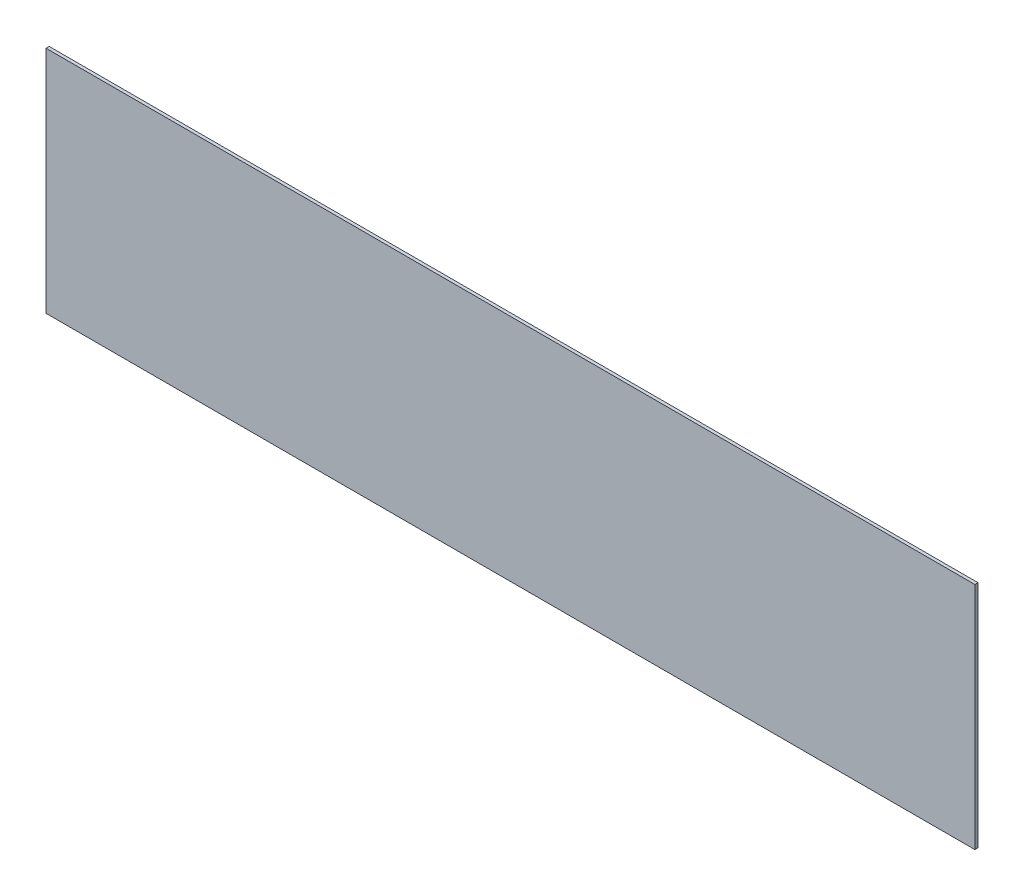
ISO-10303-21;
HEADER;
FILE_DESCRIPTION(('STEP AP214'),'2;1');
FILE_NAME('part.step','',(''),(''),'','','');
FILE_SCHEMA(('AUTOMOTIVE_DESIGN { 1 0 10303 214 1 1 1 1 }'));
ENDSEC;
DATA;
#1=APPLICATION_CONTEXT('core data for automotive mechanical design processes');
#2=APPLICATION_PROTOCOL_DEFINITION('international standard','automotive_design',2000,#1);
#3=PRODUCT_CONTEXT('',#1,'mechanical');
#4=PRODUCT('Part','Part','',(#3));
#5=PRODUCT_RELATED_PRODUCT_CATEGORY('part','',(#4));
#6=PRODUCT_DEFINITION_FORMATION('','',#4);
#7=PRODUCT_DEFINITION_CONTEXT('part definition',#1,'design');
#8=PRODUCT_DEFINITION('design','',#6,#7);
#9=PRODUCT_DEFINITION_SHAPE('','',#8);
#10=(LENGTH_UNIT() NAMED_UNIT(*) SI_UNIT(.MILLI.,.METRE.));
#11=(NAMED_UNIT(*) PLANE_ANGLE_UNIT() SI_UNIT($,.RADIAN.));
#12=(NAMED_UNIT(*) SI_UNIT($,.STERADIAN.) SOLID_ANGLE_UNIT());
#13=UNCERTAINTY_MEASURE_WITH_UNIT(LENGTH_MEASURE(1.E-05),#10,'distance_accuracy_value','');
#14=(GEOMETRIC_REPRESENTATION_CONTEXT(3) GLOBAL_UNCERTAINTY_ASSIGNED_CONTEXT((#13)) GLOBAL_UNIT_ASSIGNED_CONTEXT((#10,
#11,#12)) REPRESENTATION_CONTEXT('',''));
#15=CARTESIAN_POINT('',(0.,0.,0.));
#16=DIRECTION('',(0.,0.,1.));
#17=DIRECTION('',(1.,0.,0.));
#18=AXIS2_PLACEMENT_3D('',#15,#16,#17);
#19=CARTESIAN_POINT('',(-445.,110.,3.));
#20=DIRECTION('',(1.,0.,0.));
#21=DIRECTION('',(0.,0.,-1.));
#22=AXIS2_PLACEMENT_3D('',#19,#20,#21);
#23=PLANE('',#22);
#24=DIRECTION('',(0.,-1.,0.));
#25=VECTOR('',#24,1.);
#26=CARTESIAN_POINT('',(-445.,110.,0.));
#27=LINE('',#26,#25);
#28=CARTESIAN_POINT('',(-445.,110.,0.));
#29=VERTEX_POINT('',#28);
#30=CARTESIAN_POINT('',(-445.,-110.,0.));
#31=VERTEX_POINT('',#30);
#32=EDGE_CURVE('E107',#29,#31,#27,.T.);
#33=ORIENTED_EDGE('',*,*,#32,.T.);
#34=DIRECTION('',(0.,0.,-1.));
#35=VECTOR('',#34,1.);
#36=CARTESIAN_POINT('',(-445.,-110.,3.));
#37=LINE('',#36,#35);
#38=CARTESIAN_POINT('',(-445.,-110.,3.));
#39=VERTEX_POINT('',#38);
#40=EDGE_CURVE('E11',#39,#31,#37,.T.);
#41=ORIENTED_EDGE('',*,*,#40,.F.);
#42=DIRECTION('',(0.,-1.,0.));
#43=VECTOR('',#42,1.);
#44=CARTESIAN_POINT('',(-445.,110.,3.));
#45=LINE('',#44,#43);
#46=CARTESIAN_POINT('',(-445.,110.,3.));
#47=VERTEX_POINT('',#46);
#48=EDGE_CURVE('E91',#47,#39,#45,.T.);
#49=ORIENTED_EDGE('',*,*,#48,.F.);
#50=DIRECTION('',(0.,0.,-1.));
#51=VECTOR('',#50,1.);
#52=CARTESIAN_POINT('',(-445.,110.,3.));
#53=LINE('',#52,#51);
#54=EDGE_CURVE('E103',#47,#29,#53,.T.);
#55=ORIENTED_EDGE('',*,*,#54,.T.);
#56=EDGE_LOOP('',(#33,#41,#49,#55));
#57=FACE_BOUND('',#56,.T.);
#58=ADVANCED_FACE('F39',(#57),#23,.F.);
#59=CARTESIAN_POINT('',(-445.,-110.,3.));
#60=DIRECTION('',(0.,1.,0.));
#61=DIRECTION('',(0.,0.,1.));
#62=AXIS2_PLACEMENT_3D('',#59,#60,#61);
#63=PLANE('',#62);
#64=DIRECTION('',(1.,0.,0.));
#65=VECTOR('',#64,1.);
#66=CARTESIAN_POINT('',(-445.,-110.,0.));
#67=LINE('',#66,#65);
#68=CARTESIAN_POINT('',(445.,-110.,0.));
#69=VERTEX_POINT('',#68);
#70=EDGE_CURVE('E96',#31,#69,#67,.T.);
#71=ORIENTED_EDGE('',*,*,#70,.T.);
#72=DIRECTION('',(0.,0.,-1.));
#73=VECTOR('',#72,1.);
#74=CARTESIAN_POINT('',(445.,-110.,3.));
#75=LINE('',#74,#73);
#76=CARTESIAN_POINT('',(445.,-110.,3.));
#77=VERTEX_POINT('',#76);
#78=EDGE_CURVE('E48',#77,#69,#75,.T.);
#79=ORIENTED_EDGE('',*,*,#78,.F.);
#80=DIRECTION('',(1.,0.,0.));
#81=VECTOR('',#80,1.);
#82=CARTESIAN_POINT('',(-445.,-110.,3.));
#83=LINE('',#82,#81);
#84=EDGE_CURVE('E86',#39,#77,#83,.T.);
#85=ORIENTED_EDGE('',*,*,#84,.F.);
#86=ORIENTED_EDGE('',*,*,#40,.T.);
#87=EDGE_LOOP('',(#71,#79,#85,#86));
#88=FACE_BOUND('',#87,.T.);
#89=ADVANCED_FACE('F95',(#88),#63,.F.);
#90=CARTESIAN_POINT('',(445.,110.,3.));
#91=DIRECTION('',(-1.,0.,0.));
#92=DIRECTION('',(0.,-1.,0.));
#93=AXIS2_PLACEMENT_3D('',#90,#91,#92);
#94=PLANE('',#93);
#95=DIRECTION('',(0.,1.,0.));
#96=VECTOR('',#95,1.);
#97=CARTESIAN_POINT('',(445.,110.,0.));
#98=LINE('',#97,#96);
#99=CARTESIAN_POINT('',(445.,110.,0.));
#100=VERTEX_POINT('',#99);
#101=EDGE_CURVE('E73',#69,#100,#98,.T.);
#102=ORIENTED_EDGE('',*,*,#101,.T.);
#103=DIRECTION('',(0.,0.,-1.));
#104=VECTOR('',#103,1.);
#105=CARTESIAN_POINT('',(445.,110.,3.));
#106=LINE('',#105,#104);
#107=CARTESIAN_POINT('',(445.,110.,3.));
#108=VERTEX_POINT('',#107);
#109=EDGE_CURVE('E98',#108,#100,#106,.T.);
#110=ORIENTED_EDGE('',*,*,#109,.F.);
#111=DIRECTION('',(0.,1.,0.));
#112=VECTOR('',#111,1.);
#113=CARTESIAN_POINT('',(445.,110.,3.));
#114=LINE('',#113,#112);
#115=EDGE_CURVE('E89',#77,#108,#114,.T.);
#116=ORIENTED_EDGE('',*,*,#115,.F.);
#117=ORIENTED_EDGE('',*,*,#78,.T.);
#118=EDGE_LOOP('',(#102,#110,#116,#117));
#119=FACE_BOUND('',#118,.T.);
#120=ADVANCED_FACE('F99',(#119),#94,.F.);
#121=CARTESIAN_POINT('',(-445.,110.,3.));
#122=DIRECTION('',(0.,-1.,0.));
#123=DIRECTION('',(0.,0.,-1.));
#124=AXIS2_PLACEMENT_3D('',#121,#122,#123);
#125=PLANE('',#124);
#126=DIRECTION('',(-1.,0.,0.));
#127=VECTOR('',#126,1.);
#128=CARTESIAN_POINT('',(-445.,110.,0.));
#129=LINE('',#128,#127);
#130=EDGE_CURVE('E79',#100,#29,#129,.T.);
#131=ORIENTED_EDGE('',*,*,#130,.T.);
#132=ORIENTED_EDGE('',*,*,#54,.F.);
#133=DIRECTION('',(-1.,0.,0.));
#134=VECTOR('',#133,1.);
#135=CARTESIAN_POINT('',(-445.,110.,3.));
#136=LINE('',#135,#134);
#137=EDGE_CURVE('E56',#108,#47,#136,.T.);
#138=ORIENTED_EDGE('',*,*,#137,.F.);
#139=ORIENTED_EDGE('',*,*,#109,.T.);
#140=EDGE_LOOP('',(#131,#132,#138,#139));
#141=FACE_BOUND('',#140,.T.);
#142=ADVANCED_FACE('F120',(#141),#125,.F.);
#143=CARTESIAN_POINT('',(0.,0.,3.));
#144=DIRECTION('',(0.,0.,1.));
#145=DIRECTION('',(1.,0.,0.));
#146=AXIS2_PLACEMENT_3D('',#143,#144,#145);
#147=PLANE('',#146);
#148=ORIENTED_EDGE('',*,*,#48,.T.);
#149=ORIENTED_EDGE('',*,*,#84,.T.);
#150=ORIENTED_EDGE('',*,*,#115,.T.);
#151=ORIENTED_EDGE('',*,*,#137,.T.);
#152=EDGE_LOOP('',(#148,#149,#150,#151));
#153=FACE_BOUND('',#152,.T.);
#154=ADVANCED_FACE('F87',(#153),#147,.T.);
#155=CARTESIAN_POINT('',(0.,0.,0.));
#156=DIRECTION('',(0.,0.,1.));
#157=DIRECTION('',(1.,0.,0.));
#158=AXIS2_PLACEMENT_3D('',#155,#156,#157);
#159=PLANE('',#158);
#160=ORIENTED_EDGE('',*,*,#32,.F.);
#161=ORIENTED_EDGE('',*,*,#130,.F.);
#162=ORIENTED_EDGE('',*,*,#101,.F.);
#163=ORIENTED_EDGE('',*,*,#70,.F.);
#164=EDGE_LOOP('',(#160,#161,#162,#163));
#165=FACE_BOUND('',#164,.T.);
#166=ADVANCED_FACE('F123',(#165),#159,.F.);
#167=CLOSED_SHELL('',(#58,#89,#120,#142,#154,#166));
#168=MANIFOLD_SOLID_BREP('B2',#167);
#169=ADVANCED_BREP_SHAPE_REPRESENTATION('',(#18,#168),#14);
#170=SHAPE_DEFINITION_REPRESENTATION(#9,#169);
ENDSEC;
END-ISO-10303-21;
